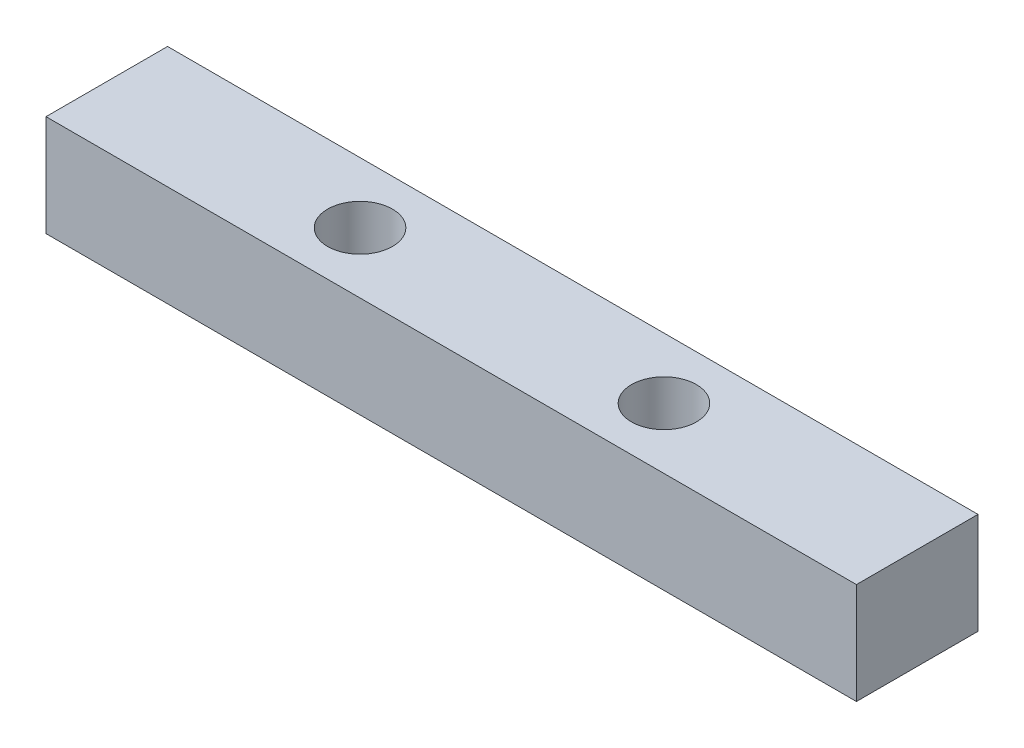
ISO-10303-21;
HEADER;
FILE_DESCRIPTION(('STEP AP214'),'2;1');
FILE_NAME('part.step','',(''),(''),'','','');
FILE_SCHEMA(('AUTOMOTIVE_DESIGN { 1 0 10303 214 1 1 1 1 }'));
ENDSEC;
DATA;
#1=APPLICATION_CONTEXT('core data for automotive mechanical design processes');
#2=APPLICATION_PROTOCOL_DEFINITION('international standard','automotive_design',2000,#1);
#3=PRODUCT_CONTEXT('',#1,'mechanical');
#4=PRODUCT('Part','Part','',(#3));
#5=PRODUCT_RELATED_PRODUCT_CATEGORY('part','',(#4));
#6=PRODUCT_DEFINITION_FORMATION('','',#4);
#7=PRODUCT_DEFINITION_CONTEXT('part definition',#1,'design');
#8=PRODUCT_DEFINITION('design','',#6,#7);
#9=PRODUCT_DEFINITION_SHAPE('','',#8);
#10=(LENGTH_UNIT() NAMED_UNIT(*) SI_UNIT(.MILLI.,.METRE.));
#11=(NAMED_UNIT(*) PLANE_ANGLE_UNIT() SI_UNIT($,.RADIAN.));
#12=(NAMED_UNIT(*) SI_UNIT($,.STERADIAN.) SOLID_ANGLE_UNIT());
#13=UNCERTAINTY_MEASURE_WITH_UNIT(LENGTH_MEASURE(1.E-05),#10,'distance_accuracy_value','');
#14=(GEOMETRIC_REPRESENTATION_CONTEXT(3) GLOBAL_UNCERTAINTY_ASSIGNED_CONTEXT((#13)) GLOBAL_UNIT_ASSIGNED_CONTEXT((#10,
#11,#12)) REPRESENTATION_CONTEXT('',''));
#15=CARTESIAN_POINT('',(0.,0.,0.));
#16=DIRECTION('',(0.,0.,1.));
#17=DIRECTION('',(1.,0.,0.));
#18=AXIS2_PLACEMENT_3D('',#15,#16,#17);
#19=CARTESIAN_POINT('',(0.,5.,0.));
#20=DIRECTION('',(0.,-1.,0.));
#21=DIRECTION('',(0.,0.,-1.));
#22=AXIS2_PLACEMENT_3D('',#19,#20,#21);
#23=PLANE('',#22);
#24=DIRECTION('',(0.,0.,-1.));
#25=VECTOR('',#24,1.);
#26=CARTESIAN_POINT('',(20.,5.,3.));
#27=LINE('',#26,#25);
#28=CARTESIAN_POINT('',(20.,5.,3.));
#29=VERTEX_POINT('',#28);
#30=CARTESIAN_POINT('',(20.,5.,-3.));
#31=VERTEX_POINT('',#30);
#32=EDGE_CURVE('E98',#29,#31,#27,.T.);
#33=ORIENTED_EDGE('',*,*,#32,.T.);
#34=DIRECTION('',(-1.,0.,0.));
#35=VECTOR('',#34,1.);
#36=CARTESIAN_POINT('',(-20.,5.,-3.));
#37=LINE('',#36,#35);
#38=CARTESIAN_POINT('',(-20.,5.,-3.));
#39=VERTEX_POINT('',#38);
#40=EDGE_CURVE('E93',#31,#39,#37,.T.);
#41=ORIENTED_EDGE('',*,*,#40,.T.);
#42=DIRECTION('',(0.,0.,1.));
#43=VECTOR('',#42,1.);
#44=CARTESIAN_POINT('',(-20.,5.,3.));
#45=LINE('',#44,#43);
#46=CARTESIAN_POINT('',(-20.,5.,3.));
#47=VERTEX_POINT('',#46);
#48=EDGE_CURVE('E96',#39,#47,#45,.T.);
#49=ORIENTED_EDGE('',*,*,#48,.T.);
#50=DIRECTION('',(1.,0.,0.));
#51=VECTOR('',#50,1.);
#52=CARTESIAN_POINT('',(-20.,5.,3.));
#53=LINE('',#52,#51);
#54=EDGE_CURVE('E63',#47,#29,#53,.T.);
#55=ORIENTED_EDGE('',*,*,#54,.T.);
#56=EDGE_LOOP('',(#33,#41,#49,#55));
#57=FACE_BOUND('',#56,.T.);
#58=CARTESIAN_POINT('',(-7.5,5.,0.));
#59=DIRECTION('',(0.,1.,0.));
#60=DIRECTION('',(0.,0.,1.));
#61=AXIS2_PLACEMENT_3D('',#58,#59,#60);
#62=CIRCLE('',#61,1.6);
#63=CARTESIAN_POINT('',(-7.5,5.,1.6));
#64=VERTEX_POINT('',#63);
#65=EDGE_CURVE('E118',#64,#64,#62,.T.);
#66=ORIENTED_EDGE('',*,*,#65,.F.);
#67=EDGE_LOOP('',(#66));
#68=FACE_BOUND('',#67,.T.);
#69=CARTESIAN_POINT('',(7.5,5.,0.));
#70=DIRECTION('',(0.,1.,0.));
#71=DIRECTION('',(0.,0.,-1.));
#72=AXIS2_PLACEMENT_3D('',#69,#70,#71);
#73=CIRCLE('',#72,1.6);
#74=CARTESIAN_POINT('',(7.5,5.,-1.6));
#75=VERTEX_POINT('',#74);
#76=EDGE_CURVE('E140',#75,#75,#73,.T.);
#77=ORIENTED_EDGE('',*,*,#76,.F.);
#78=EDGE_LOOP('',(#77));
#79=FACE_BOUND('',#78,.T.);
#80=ADVANCED_FACE('F45',(#57,#68,#79),#23,.F.);
#81=CARTESIAN_POINT('',(0.,0.,0.));
#82=DIRECTION('',(0.,-1.,0.));
#83=DIRECTION('',(0.,0.,-1.));
#84=AXIS2_PLACEMENT_3D('',#81,#82,#83);
#85=PLANE('',#84);
#86=CARTESIAN_POINT('',(-7.5,0.,0.));
#87=DIRECTION('',(0.,1.,0.));
#88=DIRECTION('',(0.,0.,1.));
#89=AXIS2_PLACEMENT_3D('',#86,#87,#88);
#90=CIRCLE('',#89,1.6);
#91=CARTESIAN_POINT('',(-7.5,0.,1.6));
#92=VERTEX_POINT('',#91);
#93=EDGE_CURVE('E136',#92,#92,#90,.T.);
#94=ORIENTED_EDGE('',*,*,#93,.T.);
#95=EDGE_LOOP('',(#94));
#96=FACE_BOUND('',#95,.T.);
#97=DIRECTION('',(0.,0.,-1.));
#98=VECTOR('',#97,1.);
#99=CARTESIAN_POINT('',(20.,0.,3.));
#100=LINE('',#99,#98);
#101=CARTESIAN_POINT('',(20.,0.,3.));
#102=VERTEX_POINT('',#101);
#103=CARTESIAN_POINT('',(20.,0.,-3.));
#104=VERTEX_POINT('',#103);
#105=EDGE_CURVE('E114',#102,#104,#100,.T.);
#106=ORIENTED_EDGE('',*,*,#105,.F.);
#107=DIRECTION('',(1.,0.,0.));
#108=VECTOR('',#107,1.);
#109=CARTESIAN_POINT('',(-20.,0.,3.));
#110=LINE('',#109,#108);
#111=CARTESIAN_POINT('',(-20.,0.,3.));
#112=VERTEX_POINT('',#111);
#113=EDGE_CURVE('E86',#112,#102,#110,.T.);
#114=ORIENTED_EDGE('',*,*,#113,.F.);
#115=DIRECTION('',(0.,0.,1.));
#116=VECTOR('',#115,1.);
#117=CARTESIAN_POINT('',(-20.,0.,3.));
#118=LINE('',#117,#116);
#119=CARTESIAN_POINT('',(-20.,0.,-3.));
#120=VERTEX_POINT('',#119);
#121=EDGE_CURVE('E80',#120,#112,#118,.T.);
#122=ORIENTED_EDGE('',*,*,#121,.F.);
#123=DIRECTION('',(-1.,0.,0.));
#124=VECTOR('',#123,1.);
#125=CARTESIAN_POINT('',(-20.,0.,-3.));
#126=LINE('',#125,#124);
#127=EDGE_CURVE('E103',#104,#120,#126,.T.);
#128=ORIENTED_EDGE('',*,*,#127,.F.);
#129=EDGE_LOOP('',(#106,#114,#122,#128));
#130=FACE_BOUND('',#129,.T.);
#131=CARTESIAN_POINT('',(7.5,0.,0.));
#132=DIRECTION('',(0.,1.,0.));
#133=DIRECTION('',(0.,0.,-1.));
#134=AXIS2_PLACEMENT_3D('',#131,#132,#133);
#135=CIRCLE('',#134,1.6);
#136=CARTESIAN_POINT('',(7.5,0.,-1.6));
#137=VERTEX_POINT('',#136);
#138=EDGE_CURVE('E144',#137,#137,#135,.T.);
#139=ORIENTED_EDGE('',*,*,#138,.T.);
#140=EDGE_LOOP('',(#139));
#141=FACE_BOUND('',#140,.T.);
#142=ADVANCED_FACE('F131',(#96,#130,#141),#85,.T.);
#143=CARTESIAN_POINT('',(20.,5.,3.));
#144=DIRECTION('',(-1.,0.,0.));
#145=DIRECTION('',(0.,0.,1.));
#146=AXIS2_PLACEMENT_3D('',#143,#144,#145);
#147=PLANE('',#146);
#148=ORIENTED_EDGE('',*,*,#105,.T.);
#149=DIRECTION('',(0.,-1.,0.));
#150=VECTOR('',#149,1.);
#151=CARTESIAN_POINT('',(20.,5.,-3.));
#152=LINE('',#151,#150);
#153=EDGE_CURVE('E11',#31,#104,#152,.T.);
#154=ORIENTED_EDGE('',*,*,#153,.F.);
#155=ORIENTED_EDGE('',*,*,#32,.F.);
#156=DIRECTION('',(0.,-1.,0.));
#157=VECTOR('',#156,1.);
#158=CARTESIAN_POINT('',(20.,5.,3.));
#159=LINE('',#158,#157);
#160=EDGE_CURVE('E110',#29,#102,#159,.T.);
#161=ORIENTED_EDGE('',*,*,#160,.T.);
#162=EDGE_LOOP('',(#148,#154,#155,#161));
#163=FACE_BOUND('',#162,.T.);
#164=ADVANCED_FACE('F47',(#163),#147,.F.);
#165=CARTESIAN_POINT('',(-20.,5.,-3.));
#166=DIRECTION('',(0.,0.,1.));
#167=DIRECTION('',(1.,0.,0.));
#168=AXIS2_PLACEMENT_3D('',#165,#166,#167);
#169=PLANE('',#168);
#170=ORIENTED_EDGE('',*,*,#127,.T.);
#171=DIRECTION('',(0.,-1.,0.));
#172=VECTOR('',#171,1.);
#173=CARTESIAN_POINT('',(-20.,5.,-3.));
#174=LINE('',#173,#172);
#175=EDGE_CURVE('E55',#39,#120,#174,.T.);
#176=ORIENTED_EDGE('',*,*,#175,.F.);
#177=ORIENTED_EDGE('',*,*,#40,.F.);
#178=ORIENTED_EDGE('',*,*,#153,.T.);
#179=EDGE_LOOP('',(#170,#176,#177,#178));
#180=FACE_BOUND('',#179,.T.);
#181=ADVANCED_FACE('F102',(#180),#169,.F.);
#182=CARTESIAN_POINT('',(-20.,5.,3.));
#183=DIRECTION('',(1.,0.,0.));
#184=DIRECTION('',(0.,0.,-1.));
#185=AXIS2_PLACEMENT_3D('',#182,#183,#184);
#186=PLANE('',#185);
#187=ORIENTED_EDGE('',*,*,#121,.T.);
#188=DIRECTION('',(0.,-1.,0.));
#189=VECTOR('',#188,1.);
#190=CARTESIAN_POINT('',(-20.,5.,3.));
#191=LINE('',#190,#189);
#192=EDGE_CURVE('E105',#47,#112,#191,.T.);
#193=ORIENTED_EDGE('',*,*,#192,.F.);
#194=ORIENTED_EDGE('',*,*,#48,.F.);
#195=ORIENTED_EDGE('',*,*,#175,.T.);
#196=EDGE_LOOP('',(#187,#193,#194,#195));
#197=FACE_BOUND('',#196,.T.);
#198=ADVANCED_FACE('F106',(#197),#186,.F.);
#199=CARTESIAN_POINT('',(-20.,5.,3.));
#200=DIRECTION('',(0.,0.,-1.));
#201=DIRECTION('',(-1.,0.,0.));
#202=AXIS2_PLACEMENT_3D('',#199,#200,#201);
#203=PLANE('',#202);
#204=ORIENTED_EDGE('',*,*,#113,.T.);
#205=ORIENTED_EDGE('',*,*,#160,.F.);
#206=ORIENTED_EDGE('',*,*,#54,.F.);
#207=ORIENTED_EDGE('',*,*,#192,.T.);
#208=EDGE_LOOP('',(#204,#205,#206,#207));
#209=FACE_BOUND('',#208,.T.);
#210=ADVANCED_FACE('F128',(#209),#203,.F.);
#211=CARTESIAN_POINT('',(-7.5,5.,0.));
#212=DIRECTION('',(0.,-1.,0.));
#213=DIRECTION('',(0.,0.,-1.));
#214=AXIS2_PLACEMENT_3D('',#211,#212,#213);
#215=CYLINDRICAL_SURFACE('',#214,1.6);
#216=ORIENTED_EDGE('',*,*,#65,.T.);
#217=EDGE_LOOP('',(#216));
#218=FACE_BOUND('',#217,.T.);
#219=ORIENTED_EDGE('',*,*,#93,.F.);
#220=EDGE_LOOP('',(#219));
#221=FACE_BOUND('',#220,.T.);
#222=ADVANCED_FACE('F163',(#218,#221),#215,.F.);
#223=CARTESIAN_POINT('',(7.5,5.,0.));
#224=DIRECTION('',(0.,-1.,0.));
#225=DIRECTION('',(0.,0.,-1.));
#226=AXIS2_PLACEMENT_3D('',#223,#224,#225);
#227=CYLINDRICAL_SURFACE('',#226,1.6);
#228=ORIENTED_EDGE('',*,*,#76,.T.);
#229=EDGE_LOOP('',(#228));
#230=FACE_BOUND('',#229,.T.);
#231=ORIENTED_EDGE('',*,*,#138,.F.);
#232=EDGE_LOOP('',(#231));
#233=FACE_BOUND('',#232,.T.);
#234=ADVANCED_FACE('F152',(#230,#233),#227,.F.);
#235=CLOSED_SHELL('',(#80,#142,#164,#181,#198,#210,#222,#234));
#236=MANIFOLD_SOLID_BREP('B2',#235);
#237=ADVANCED_BREP_SHAPE_REPRESENTATION('',(#18,#236),#14);
#238=SHAPE_DEFINITION_REPRESENTATION(#9,#237);
ENDSEC;
END-ISO-10303-21;
